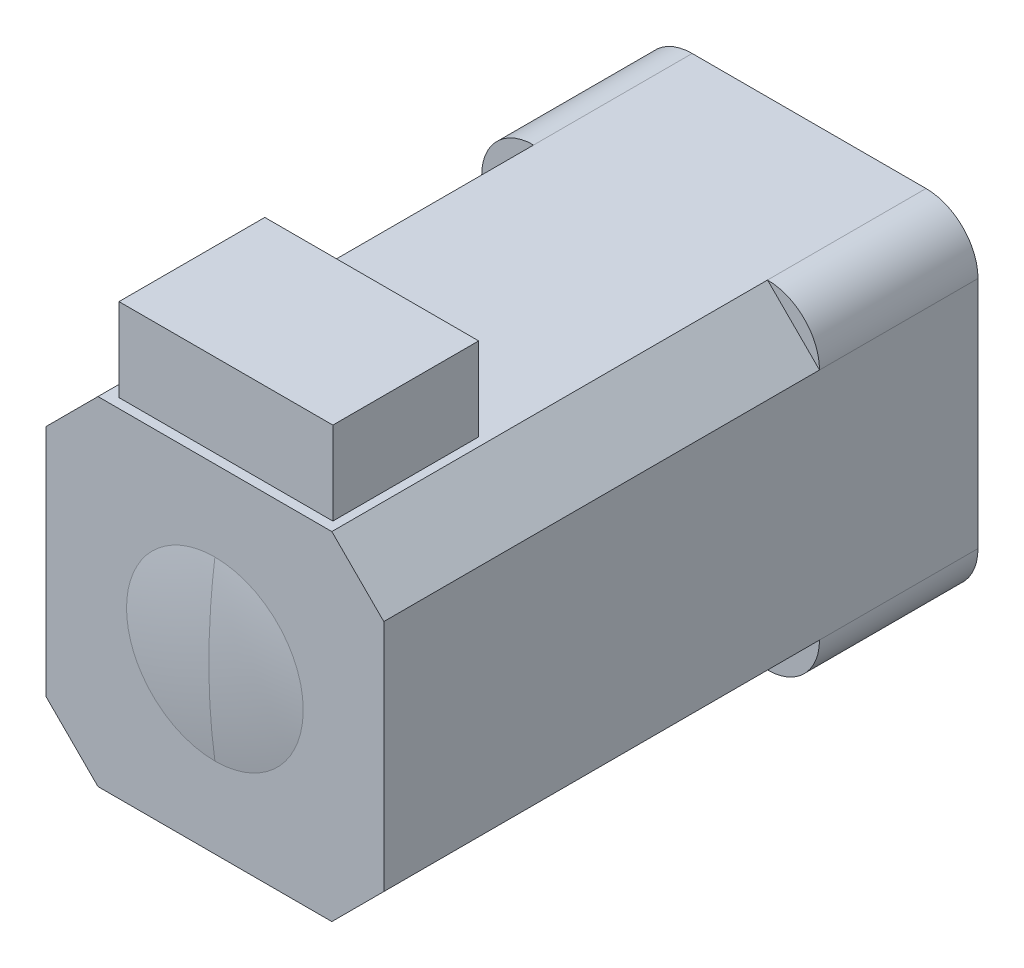
ISO-10303-21;
HEADER;
FILE_DESCRIPTION(('STEP AP214'),'2;1');
FILE_NAME('part.step','',(''),(''),'','','');
FILE_SCHEMA(('AUTOMOTIVE_DESIGN { 1 0 10303 214 1 1 1 1 }'));
ENDSEC;
DATA;
#1=APPLICATION_CONTEXT('core data for automotive mechanical design processes');
#2=APPLICATION_PROTOCOL_DEFINITION('international standard','automotive_design',2000,#1);
#3=PRODUCT_CONTEXT('',#1,'mechanical');
#4=PRODUCT('Part','Part','',(#3));
#5=PRODUCT_RELATED_PRODUCT_CATEGORY('part','',(#4));
#6=PRODUCT_DEFINITION_FORMATION('','',#4);
#7=PRODUCT_DEFINITION_CONTEXT('part definition',#1,'design');
#8=PRODUCT_DEFINITION('design','',#6,#7);
#9=PRODUCT_DEFINITION_SHAPE('','',#8);
#10=(LENGTH_UNIT() NAMED_UNIT(*) SI_UNIT(.MILLI.,.METRE.));
#11=(NAMED_UNIT(*) PLANE_ANGLE_UNIT() SI_UNIT($,.RADIAN.));
#12=(NAMED_UNIT(*) SI_UNIT($,.STERADIAN.) SOLID_ANGLE_UNIT());
#13=UNCERTAINTY_MEASURE_WITH_UNIT(LENGTH_MEASURE(1.E-05),#10,'distance_accuracy_value','');
#14=(GEOMETRIC_REPRESENTATION_CONTEXT(3) GLOBAL_UNCERTAINTY_ASSIGNED_CONTEXT((#13)) GLOBAL_UNIT_ASSIGNED_CONTEXT((#10,
#11,#12)) REPRESENTATION_CONTEXT('',''));
#15=CARTESIAN_POINT('',(0.,0.,0.));
#16=DIRECTION('',(0.,0.,1.));
#17=DIRECTION('',(1.,0.,0.));
#18=AXIS2_PLACEMENT_3D('',#15,#16,#17);
#19=CARTESIAN_POINT('',(1533.40236962723,97.0000000000027,1693.5));
#20=DIRECTION('',(0.,1.,0.));
#21=DIRECTION('',(0.,0.,1.));
#22=AXIS2_PLACEMENT_3D('',#19,#20,#21);
#23=PLANE('',#22);
#24=DIRECTION('',(0.,0.,1.));
#25=VECTOR('',#24,1.);
#26=CARTESIAN_POINT('',(1546.71167023781,97.0000000000028,1690.37389267724));
#27=LINE('',#26,#25);
#28=CARTESIAN_POINT('',(1546.71167023781,97.0000000000028,1746.49254262433));
#29=VERTEX_POINT('',#28);
#30=CARTESIAN_POINT('',(1546.71167023781,97.0000000000028,1690.37389267724));
#31=VERTEX_POINT('',#30);
#32=EDGE_CURVE('E195',#29,#31,#27,.F.);
#33=ORIENTED_EDGE('',*,*,#32,.T.);
#34=DIRECTION('',(1.,0.,0.));
#35=VECTOR('',#34,1.);
#36=CARTESIAN_POINT('',(1464.40226837174,97.0000000000028,1690.37389267724));
#37=LINE('',#36,#35);
#38=CARTESIAN_POINT('',(1464.40226837174,97.0000000000028,1690.37389267724));
#39=VERTEX_POINT('',#38);
#40=EDGE_CURVE('E185',#31,#39,#37,.F.);
#41=ORIENTED_EDGE('',*,*,#40,.T.);
#42=DIRECTION('',(0.,0.,1.));
#43=VECTOR('',#42,1.);
#44=CARTESIAN_POINT('',(1464.40226837174,97.0000000000028,1690.37389267724));
#45=LINE('',#44,#43);
#46=CARTESIAN_POINT('',(1464.40226837174,97.0000000000028,1746.49254262433));
#47=VERTEX_POINT('',#46);
#48=EDGE_CURVE('E189',#39,#47,#45,.T.);
#49=ORIENTED_EDGE('',*,*,#48,.T.);
#50=DIRECTION('',(1.,0.,0.));
#51=VECTOR('',#50,1.);
#52=CARTESIAN_POINT('',(1464.40226837174,97.0000000000028,1746.49254262433));
#53=LINE('',#52,#51);
#54=EDGE_CURVE('E193',#47,#29,#53,.T.);
#55=ORIENTED_EDGE('',*,*,#54,.T.);
#56=EDGE_LOOP('',(#33,#41,#49,#55));
#57=FACE_BOUND('',#56,.T.);
#58=ADVANCED_FACE('F17',(#57),#23,.T.);
#59=CARTESIAN_POINT('',(1505.,7.65638399887561E-12,1582.5));
#60=DIRECTION('',(0.,0.,1.));
#61=DIRECTION('',(0.,-1.,0.));
#62=AXIS2_PLACEMENT_3D('',#59,#60,#61);
#63=PLANE('',#62);
#64=CARTESIAN_POINT('',(1550.,45.0000000000076,1582.5));
#65=DIRECTION('',(0.,0.,1.));
#66=DIRECTION('',(0.,-1.,0.));
#67=AXIS2_PLACEMENT_3D('',#64,#65,#66);
#68=CIRCLE('',#67,20.);
#69=CARTESIAN_POINT('',(1550.,65.0000000000077,1582.5));
#70=VERTEX_POINT('',#69);
#71=CARTESIAN_POINT('',(1570.,45.0000000000077,1582.5));
#72=VERTEX_POINT('',#71);
#73=EDGE_CURVE('E143',#70,#72,#68,.F.);
#74=ORIENTED_EDGE('',*,*,#73,.F.);
#75=DIRECTION('',(0.707106781186547,-0.707106781186548,0.));
#76=VECTOR('',#75,1.);
#77=CARTESIAN_POINT('',(1570.,45.0000000000077,1582.5));
#78=LINE('',#77,#76);
#79=EDGE_CURVE('E174',#70,#72,#78,.T.);
#80=ORIENTED_EDGE('',*,*,#79,.T.);
#81=EDGE_LOOP('',(#74,#80));
#82=FACE_BOUND('',#81,.T.);
#83=ADVANCED_FACE('F352',(#82),#63,.T.);
#84=CARTESIAN_POINT('',(1546.71167023781,196.61998046293,1690.37389267724));
#85=DIRECTION('',(-1.,0.,0.));
#86=DIRECTION('',(0.,-1.,0.));
#87=AXIS2_PLACEMENT_3D('',#84,#85,#86);
#88=PLANE('',#87);
#89=DIRECTION('',(0.,0.,1.));
#90=VECTOR('',#89,1.);
#91=CARTESIAN_POINT('',(1546.71167023781,65.0000000000077,1583.5));
#92=LINE('',#91,#90);
#93=CARTESIAN_POINT('',(1546.71167023781,65.0000000000078,1690.37389267724));
#94=VERTEX_POINT('',#93);
#95=CARTESIAN_POINT('',(1546.71167023781,65.0000000000078,1746.49254262433));
#96=VERTEX_POINT('',#95);
#97=EDGE_CURVE('E198',#94,#96,#92,.T.);
#98=ORIENTED_EDGE('',*,*,#97,.F.);
#99=DIRECTION('',(0.,-1.,0.));
#100=VECTOR('',#99,1.);
#101=CARTESIAN_POINT('',(1546.71167023781,196.61998046293,1690.37389267724));
#102=LINE('',#101,#100);
#103=EDGE_CURVE('E144',#94,#31,#102,.F.);
#104=ORIENTED_EDGE('',*,*,#103,.T.);
#105=ORIENTED_EDGE('',*,*,#32,.F.);
#106=DIRECTION('',(0.,1.,0.));
#107=VECTOR('',#106,1.);
#108=CARTESIAN_POINT('',(1546.71167023781,196.61998046293,1746.49254262433));
#109=LINE('',#108,#107);
#110=EDGE_CURVE('E191',#29,#96,#109,.F.);
#111=ORIENTED_EDGE('',*,*,#110,.T.);
#112=EDGE_LOOP('',(#98,#104,#105,#111));
#113=FACE_BOUND('',#112,.T.);
#114=ADVANCED_FACE('F400',(#113),#88,.F.);
#115=CARTESIAN_POINT('',(1464.40226837174,196.61998046293,1746.49254262433));
#116=DIRECTION('',(0.,0.,-1.));
#117=DIRECTION('',(0.,1.,0.));
#118=AXIS2_PLACEMENT_3D('',#115,#116,#117);
#119=PLANE('',#118);
#120=DIRECTION('',(1.,0.,0.));
#121=VECTOR('',#120,1.);
#122=CARTESIAN_POINT('',(1466.,65.0000000000079,1746.49254262433));
#123=LINE('',#122,#121);
#124=CARTESIAN_POINT('',(1464.40226837174,65.0000000000078,1746.49254262433));
#125=VERTEX_POINT('',#124);
#126=EDGE_CURVE('E320',#96,#125,#123,.F.);
#127=ORIENTED_EDGE('',*,*,#126,.F.);
#128=ORIENTED_EDGE('',*,*,#110,.F.);
#129=ORIENTED_EDGE('',*,*,#54,.F.);
#130=DIRECTION('',(0.,1.,0.));
#131=VECTOR('',#130,1.);
#132=CARTESIAN_POINT('',(1464.40226837174,196.61998046293,1746.49254262433));
#133=LINE('',#132,#131);
#134=EDGE_CURVE('E187',#47,#125,#133,.F.);
#135=ORIENTED_EDGE('',*,*,#134,.T.);
#136=EDGE_LOOP('',(#127,#128,#129,#135));
#137=FACE_BOUND('',#136,.T.);
#138=ADVANCED_FACE('F396',(#137),#119,.F.);
#139=CARTESIAN_POINT('',(1464.40226837174,196.61998046293,1690.37389267724));
#140=DIRECTION('',(1.,0.,0.));
#141=DIRECTION('',(0.,1.,0.));
#142=AXIS2_PLACEMENT_3D('',#139,#140,#141);
#143=PLANE('',#142);
#144=DIRECTION('',(0.,0.,1.));
#145=VECTOR('',#144,1.);
#146=CARTESIAN_POINT('',(1464.40226837174,65.0000000000077,1583.5));
#147=LINE('',#146,#145);
#148=CARTESIAN_POINT('',(1464.40226837174,65.0000000000078,1690.37389267724));
#149=VERTEX_POINT('',#148);
#150=EDGE_CURVE('E317',#125,#149,#147,.F.);
#151=ORIENTED_EDGE('',*,*,#150,.F.);
#152=ORIENTED_EDGE('',*,*,#134,.F.);
#153=ORIENTED_EDGE('',*,*,#48,.F.);
#154=DIRECTION('',(0.,-1.,0.));
#155=VECTOR('',#154,1.);
#156=CARTESIAN_POINT('',(1464.40226837174,196.61998046293,1690.37389267724));
#157=LINE('',#156,#155);
#158=EDGE_CURVE('E183',#39,#149,#157,.T.);
#159=ORIENTED_EDGE('',*,*,#158,.T.);
#160=EDGE_LOOP('',(#151,#152,#153,#159));
#161=FACE_BOUND('',#160,.T.);
#162=ADVANCED_FACE('F392',(#161),#143,.F.);
#163=CARTESIAN_POINT('',(1464.40226837174,196.61998046293,1690.37389267724));
#164=DIRECTION('',(0.,0.,1.));
#165=DIRECTION('',(0.,-1.,0.));
#166=AXIS2_PLACEMENT_3D('',#163,#164,#165);
#167=PLANE('',#166);
#168=DIRECTION('',(1.,0.,0.));
#169=VECTOR('',#168,1.);
#170=CARTESIAN_POINT('',(1466.,65.0000000000078,1690.37389267724));
#171=LINE('',#170,#169);
#172=EDGE_CURVE('E311',#149,#94,#171,.T.);
#173=ORIENTED_EDGE('',*,*,#172,.F.);
#174=ORIENTED_EDGE('',*,*,#158,.F.);
#175=ORIENTED_EDGE('',*,*,#40,.F.);
#176=ORIENTED_EDGE('',*,*,#103,.F.);
#177=EDGE_LOOP('',(#173,#174,#175,#176));
#178=FACE_BOUND('',#177,.T.);
#179=ADVANCED_FACE('F389',(#178),#167,.F.);
#180=CARTESIAN_POINT('',(1505.,7.65638399887561E-12,1582.5));
#181=DIRECTION('',(0.,0.,1.));
#182=DIRECTION('',(0.,-1.,0.));
#183=AXIS2_PLACEMENT_3D('',#180,#181,#182);
#184=PLANE('',#183);
#185=CARTESIAN_POINT('',(1460.,45.0000000000077,1582.5));
#186=DIRECTION('',(0.,0.,1.));
#187=DIRECTION('',(0.,-1.,0.));
#188=AXIS2_PLACEMENT_3D('',#185,#186,#187);
#189=CIRCLE('',#188,20.);
#190=CARTESIAN_POINT('',(1440.,45.0000000000076,1582.5));
#191=VERTEX_POINT('',#190);
#192=CARTESIAN_POINT('',(1460.,65.0000000000077,1582.5));
#193=VERTEX_POINT('',#192);
#194=EDGE_CURVE('E20',#191,#193,#189,.F.);
#195=ORIENTED_EDGE('',*,*,#194,.F.);
#196=DIRECTION('',(0.707106781186547,0.707106781186548,0.));
#197=VECTOR('',#196,1.);
#198=CARTESIAN_POINT('',(1460.,65.0000000000077,1582.5));
#199=LINE('',#198,#197);
#200=EDGE_CURVE('E145',#191,#193,#199,.T.);
#201=ORIENTED_EDGE('',*,*,#200,.T.);
#202=EDGE_LOOP('',(#195,#201));
#203=FACE_BOUND('',#202,.T.);
#204=ADVANCED_FACE('F146',(#203),#184,.T.);
#205=CARTESIAN_POINT('',(1460.,45.0000000000075,1337.65221692848));
#206=DIRECTION('',(0.,0.,1.));
#207=DIRECTION('',(0.,-1.,0.));
#208=AXIS2_PLACEMENT_3D('',#205,#206,#207);
#209=CYLINDRICAL_SURFACE('',#208,20.);
#210=CARTESIAN_POINT('',(1460.,45.0000000000077,1521.49998003698));
#211=DIRECTION('',(0.,0.,1.));
#212=DIRECTION('',(0.,-1.,0.));
#213=AXIS2_PLACEMENT_3D('',#210,#211,#212);
#214=CIRCLE('',#213,20.);
#215=CARTESIAN_POINT('',(1440.,45.0000000000076,1521.49998003698));
#216=VERTEX_POINT('',#215);
#217=CARTESIAN_POINT('',(1460.,65.0000000000076,1521.49998003698));
#218=VERTEX_POINT('',#217);
#219=EDGE_CURVE('E296',#216,#218,#214,.F.);
#220=ORIENTED_EDGE('',*,*,#219,.F.);
#221=DIRECTION('',(0.,0.,1.));
#222=VECTOR('',#221,1.);
#223=CARTESIAN_POINT('',(1440.00000000001,45.0000000000076,1693.5));
#224=LINE('',#223,#222);
#225=EDGE_CURVE('E141',#191,#216,#224,.F.);
#226=ORIENTED_EDGE('',*,*,#225,.F.);
#227=ORIENTED_EDGE('',*,*,#194,.T.);
#228=DIRECTION('',(0.,0.,1.));
#229=VECTOR('',#228,1.);
#230=CARTESIAN_POINT('',(1460.,65.0000000000077,1583.5));
#231=LINE('',#230,#229);
#232=EDGE_CURVE('E139',#218,#193,#231,.T.);
#233=ORIENTED_EDGE('',*,*,#232,.F.);
#234=EDGE_LOOP('',(#220,#226,#227,#233));
#235=FACE_BOUND('',#234,.T.);
#236=ADVANCED_FACE('F137',(#235),#209,.T.);
#237=CARTESIAN_POINT('',(1550.,45.0000000000074,1337.65221692848));
#238=DIRECTION('',(0.,0.,1.));
#239=DIRECTION('',(0.,-1.,0.));
#240=AXIS2_PLACEMENT_3D('',#237,#238,#239);
#241=CYLINDRICAL_SURFACE('',#240,20.);
#242=CARTESIAN_POINT('',(1550.,45.0000000000076,1521.49998003698));
#243=DIRECTION('',(0.,0.,1.));
#244=DIRECTION('',(0.,-1.,0.));
#245=AXIS2_PLACEMENT_3D('',#242,#243,#244);
#246=CIRCLE('',#245,20.);
#247=CARTESIAN_POINT('',(1550.,65.0000000000076,1521.49998003698));
#248=VERTEX_POINT('',#247);
#249=CARTESIAN_POINT('',(1570.,45.0000000000076,1521.49998003698));
#250=VERTEX_POINT('',#249);
#251=EDGE_CURVE('E294',#248,#250,#246,.F.);
#252=ORIENTED_EDGE('',*,*,#251,.F.);
#253=DIRECTION('',(0.,0.,1.));
#254=VECTOR('',#253,1.);
#255=CARTESIAN_POINT('',(1550.,65.0000000000077,1583.5));
#256=LINE('',#255,#254);
#257=EDGE_CURVE('E161',#70,#248,#256,.F.);
#258=ORIENTED_EDGE('',*,*,#257,.F.);
#259=ORIENTED_EDGE('',*,*,#73,.T.);
#260=DIRECTION('',(0.,0.,1.));
#261=VECTOR('',#260,1.);
#262=CARTESIAN_POINT('',(1570.,45.0000000000076,1583.5));
#263=LINE('',#262,#261);
#264=EDGE_CURVE('E178',#250,#72,#263,.T.);
#265=ORIENTED_EDGE('',*,*,#264,.F.);
#266=EDGE_LOOP('',(#252,#258,#259,#265));
#267=FACE_BOUND('',#266,.T.);
#268=ADVANCED_FACE('F348',(#267),#241,.T.);
#269=CARTESIAN_POINT('',(1505.,7.65638399887561E-12,1582.5));
#270=DIRECTION('',(0.,0.,1.));
#271=DIRECTION('',(0.,-1.,0.));
#272=AXIS2_PLACEMENT_3D('',#269,#270,#271);
#273=PLANE('',#272);
#274=CARTESIAN_POINT('',(1550.,-44.9999999999924,1582.5));
#275=DIRECTION('',(0.,0.,1.));
#276=DIRECTION('',(0.,-1.,0.));
#277=AXIS2_PLACEMENT_3D('',#274,#275,#276);
#278=CIRCLE('',#277,20.);
#279=CARTESIAN_POINT('',(1570.,-44.9999999999923,1582.5));
#280=VERTEX_POINT('',#279);
#281=CARTESIAN_POINT('',(1550.,-64.9999999999956,1582.5));
#282=VERTEX_POINT('',#281);
#283=EDGE_CURVE('E366',#280,#282,#278,.F.);
#284=ORIENTED_EDGE('',*,*,#283,.F.);
#285=DIRECTION('',(-0.707106781186548,-0.707106781186547,0.));
#286=VECTOR('',#285,1.);
#287=CARTESIAN_POINT('',(1550.,-64.9999999999923,1582.5));
#288=LINE('',#287,#286);
#289=EDGE_CURVE('E327',#280,#282,#288,.T.);
#290=ORIENTED_EDGE('',*,*,#289,.T.);
#291=EDGE_LOOP('',(#284,#290));
#292=FACE_BOUND('',#291,.T.);
#293=ADVANCED_FACE('F365',(#292),#273,.T.);
#294=CARTESIAN_POINT('',(1570.,39.0000000000076,1583.5));
#295=DIRECTION('',(1.,0.,0.));
#296=DIRECTION('',(0.,1.,0.));
#297=AXIS2_PLACEMENT_3D('',#294,#295,#296);
#298=PLANE('',#297);
#299=DIRECTION('',(0.,1.,0.));
#300=VECTOR('',#299,1.);
#301=CARTESIAN_POINT('',(1570.,5.80032032303539,1521.49998003698));
#302=LINE('',#301,#300);
#303=CARTESIAN_POINT('',(1570.,-44.9999999999924,1521.49998003698));
#304=VERTEX_POINT('',#303);
#305=EDGE_CURVE('E291',#250,#304,#302,.F.);
#306=ORIENTED_EDGE('',*,*,#305,.F.);
#307=ORIENTED_EDGE('',*,*,#264,.T.);
#308=DIRECTION('',(0.,0.,1.));
#309=VECTOR('',#308,1.);
#310=CARTESIAN_POINT('',(1570.,45.0000000000077,1750.17750649952));
#311=LINE('',#310,#309);
#312=CARTESIAN_POINT('',(1570.,45.0000000000077,1750.17750649952));
#313=VERTEX_POINT('',#312);
#314=EDGE_CURVE('E177',#72,#313,#311,.T.);
#315=ORIENTED_EDGE('',*,*,#314,.T.);
#316=DIRECTION('',(0.,-1.,0.));
#317=VECTOR('',#316,1.);
#318=CARTESIAN_POINT('',(1570.,65.0000000000078,1750.17750649952));
#319=LINE('',#318,#317);
#320=CARTESIAN_POINT('',(1570.,-44.9999999999921,1750.17750649952));
#321=VERTEX_POINT('',#320);
#322=EDGE_CURVE('E287',#321,#313,#319,.F.);
#323=ORIENTED_EDGE('',*,*,#322,.F.);
#324=DIRECTION('',(0.,0.,1.));
#325=VECTOR('',#324,1.);
#326=CARTESIAN_POINT('',(1570.,-44.9999999999922,1750.17750649952));
#327=LINE('',#326,#325);
#328=EDGE_CURVE('E290',#321,#280,#327,.F.);
#329=ORIENTED_EDGE('',*,*,#328,.T.);
#330=DIRECTION('',(0.,0.,1.));
#331=VECTOR('',#330,1.);
#332=CARTESIAN_POINT('',(1570.,-44.9999999999924,1337.65221692848));
#333=LINE('',#332,#331);
#334=EDGE_CURVE('E328',#304,#280,#333,.T.);
#335=ORIENTED_EDGE('',*,*,#334,.F.);
#336=EDGE_LOOP('',(#306,#307,#315,#323,#329,#335));
#337=FACE_BOUND('',#336,.T.);
#338=ADVANCED_FACE('F356',(#337),#298,.T.);
#339=CARTESIAN_POINT('',(1570.,45.0000000000078,1750.17750649952));
#340=DIRECTION('',(-0.707106781186548,-0.707106781186547,0.));
#341=DIRECTION('',(0.707106781186547,-0.707106781186548,0.));
#342=AXIS2_PLACEMENT_3D('',#339,#340,#341);
#343=PLANE('',#342);
#344=DIRECTION('',(-0.707106781186546,0.707106781186549,0.));
#345=VECTOR('',#344,1.);
#346=CARTESIAN_POINT('',(1570.,45.0000000000077,1750.17750649952));
#347=LINE('',#346,#345);
#348=CARTESIAN_POINT('',(1550.,65.0000000000078,1750.17750649952));
#349=VERTEX_POINT('',#348);
#350=EDGE_CURVE('E284',#313,#349,#347,.T.);
#351=ORIENTED_EDGE('',*,*,#350,.F.);
#352=ORIENTED_EDGE('',*,*,#314,.F.);
#353=ORIENTED_EDGE('',*,*,#79,.F.);
#354=DIRECTION('',(0.,0.,1.));
#355=VECTOR('',#354,1.);
#356=CARTESIAN_POINT('',(1550.,65.0000000000077,1583.5));
#357=LINE('',#356,#355);
#358=EDGE_CURVE('E151',#349,#70,#357,.F.);
#359=ORIENTED_EDGE('',*,*,#358,.F.);
#360=EDGE_LOOP('',(#351,#352,#353,#359));
#361=FACE_BOUND('',#360,.T.);
#362=ADVANCED_FACE('F360',(#361),#343,.F.);
#363=CARTESIAN_POINT('',(1466.,65.0000000000077,1583.5));
#364=DIRECTION('',(0.,1.,0.));
#365=DIRECTION('',(0.,0.,1.));
#366=AXIS2_PLACEMENT_3D('',#363,#364,#365);
#367=PLANE('',#366);
#368=DIRECTION('',(1.,0.,0.));
#369=VECTOR('',#368,1.);
#370=CARTESIAN_POINT('',(1440.,65.0000000000078,1750.17750649952));
#371=LINE('',#370,#369);
#372=CARTESIAN_POINT('',(1460.,65.0000000000078,1750.17750649952));
#373=VERTEX_POINT('',#372);
#374=EDGE_CURVE('E282',#349,#373,#371,.F.);
#375=ORIENTED_EDGE('',*,*,#374,.F.);
#376=ORIENTED_EDGE('',*,*,#358,.T.);
#377=ORIENTED_EDGE('',*,*,#257,.T.);
#378=DIRECTION('',(1.,0.,0.));
#379=VECTOR('',#378,1.);
#380=CARTESIAN_POINT('',(1505.,65.0000000000076,1521.49998003698));
#381=LINE('',#380,#379);
#382=EDGE_CURVE('E159',#218,#248,#381,.T.);
#383=ORIENTED_EDGE('',*,*,#382,.F.);
#384=ORIENTED_EDGE('',*,*,#232,.T.);
#385=DIRECTION('',(0.,0.,1.));
#386=VECTOR('',#385,1.);
#387=CARTESIAN_POINT('',(1460.,65.0000000000077,1750.17750649952));
#388=LINE('',#387,#386);
#389=EDGE_CURVE('E150',#193,#373,#388,.T.);
#390=ORIENTED_EDGE('',*,*,#389,.T.);
#391=EDGE_LOOP('',(#375,#376,#377,#383,#384,#390));
#392=FACE_BOUND('',#391,.T.);
#393=ORIENTED_EDGE('',*,*,#150,.T.);
#394=ORIENTED_EDGE('',*,*,#172,.T.);
#395=ORIENTED_EDGE('',*,*,#97,.T.);
#396=ORIENTED_EDGE('',*,*,#126,.T.);
#397=EDGE_LOOP('',(#393,#394,#395,#396));
#398=FACE_BOUND('',#397,.T.);
#399=ADVANCED_FACE('F155',(#392,#398),#367,.T.);
#400=CARTESIAN_POINT('',(1460.,65.0000000000078,1750.17750649952));
#401=DIRECTION('',(0.707106781186548,-0.707106781186547,0.));
#402=DIRECTION('',(0.707106781186547,0.707106781186548,0.));
#403=AXIS2_PLACEMENT_3D('',#400,#401,#402);
#404=PLANE('',#403);
#405=DIRECTION('',(-0.707106781186544,-0.707106781186551,0.));
#406=VECTOR('',#405,1.);
#407=CARTESIAN_POINT('',(1460.,65.0000000000078,1750.17750649952));
#408=LINE('',#407,#406);
#409=CARTESIAN_POINT('',(1440.,45.0000000000077,1750.17750649952));
#410=VERTEX_POINT('',#409);
#411=EDGE_CURVE('E165',#373,#410,#408,.T.);
#412=ORIENTED_EDGE('',*,*,#411,.F.);
#413=ORIENTED_EDGE('',*,*,#389,.F.);
#414=ORIENTED_EDGE('',*,*,#200,.F.);
#415=DIRECTION('',(0.,0.,1.));
#416=VECTOR('',#415,1.);
#417=CARTESIAN_POINT('',(1440.00000000001,45.0000000000076,1693.5));
#418=LINE('',#417,#416);
#419=EDGE_CURVE('E173',#410,#191,#418,.F.);
#420=ORIENTED_EDGE('',*,*,#419,.F.);
#421=EDGE_LOOP('',(#412,#413,#414,#420));
#422=FACE_BOUND('',#421,.T.);
#423=ADVANCED_FACE('F163',(#422),#404,.F.);
#424=CARTESIAN_POINT('',(1505.,-34.4035175258015,1750.1215207102));
#425=CARTESIAN_POINT('',(1493.65664513052,-34.4035175258014,1750.1215207102));
#426=CARTESIAN_POINT('',(1482.34001705167,-34.4035175258014,1749.34329926354));
#427=CARTESIAN_POINT('',(1471.10344339938,-34.4035175258015,1747.79052360304));
#428=CARTESIAN_POINT('',(1505.00000000001,-11.6775888948183,1753.2789680524));
#429=CARTESIAN_POINT('',(1493.51200485216,-11.6775888948183,1753.2789680524));
#430=CARTESIAN_POINT('',(1482.05107729099,-11.6775888948183,1752.49082342446));
#431=CARTESIAN_POINT('',(1470.67122493856,-11.6775888948183,1750.91824816267));
#432=CARTESIAN_POINT('',(1505.00000000001,11.2666250264183,1753.29776687901));
#433=CARTESIAN_POINT('',(1493.51114369211,11.2666250264182,1753.29776687901));
#434=CARTESIAN_POINT('',(1482.04935699992,11.2666250264182,1752.50956317038));
#435=CARTESIAN_POINT('',(1470.66865159401,11.2666250264183,1750.93687002562));
#436=CARTESIAN_POINT('',(1505.,33.997697109422,1750.17756370988));
#437=CARTESIAN_POINT('',(1493.65407784303,33.997697109422,1750.17756370988));
#438=CARTESIAN_POINT('',(1482.33488852563,33.997697109422,1749.39916613207));
#439=CARTESIAN_POINT('',(1471.09577175314,33.997697109422,1747.84603903924));
#440=CARTESIAN_POINT('',(1505.,34.2235830990624,1750.14655724533));
#441=CARTESIAN_POINT('',(1493.65549822576,34.2235830990624,1750.14655724533));
#442=CARTESIAN_POINT('',(1482.33772594443,34.2235830990624,1749.3682571142));
#443=CARTESIAN_POINT('',(1471.10001618382,34.2235830990624,1747.81532445554));
#444=CARTESIAN_POINT('',(1505.,34.4494690887031,1750.11555078078));
#445=CARTESIAN_POINT('',(1493.65691860848,34.4494690887031,1750.11555078078));
#446=CARTESIAN_POINT('',(1482.34056336323,34.4494690887031,1749.33734809633));
#447=CARTESIAN_POINT('',(1471.1042606145,34.4494690887032,1747.78460987184));
#448=CARTESIAN_POINT('',(1505.,34.6753550783438,1750.08454431623));
#449=CARTESIAN_POINT('',(1493.65833899121,34.6753550783438,1750.08454431623));
#450=CARTESIAN_POINT('',(1482.34340078203,34.6753550783439,1749.30643907846));
#451=CARTESIAN_POINT('',(1471.10850504519,34.6753550783438,1747.75389528813));
#452=(BOUNDED_SURFACE() B_SPLINE_SURFACE(3,3,((#424,#425,#426,#427),(#428,#429,#430,#431),(#432,
#433,#434,#435),(#436,#437,#438,#439),(#440,#441,#442,#443),(#444,#445,#446,#447),(#448,#449,
#450,#451)),.UNSPECIFIED.,.F.,.F.,.F.) B_SPLINE_SURFACE_WITH_KNOTS((4,3,4),(4,4),(0.,
0.99009900990099,1.),(0.,1.),
.UNSPECIFIED.) GEOMETRIC_REPRESENTATION_ITEM() RATIONAL_B_SPLINE_SURFACE(((1.,0.998429224807992,
0.998429224807992,1.),(0.993732230560502,0.992171300625239,0.992171300625239,0.993732230560502),
(0.993732230560502,0.992171300625239,0.992171300625239,0.993732230560502),(1.,0.998429224807992,
0.998429224807992,1.),(1.,0.998429224807992,0.998429224807992,1.),(1.,0.998429224807992,
0.998429224807992,1.),(1.,0.998429224807992,0.998429224807992,1.))) REPRESENTATION_ITEM('') SURFACE());
#453=CARTESIAN_POINT('',(1505.,-34.4035175258006,1750.1215207102));
#454=CARTESIAN_POINT('',(1505.,-11.6775888948177,1753.2789680524));
#455=CARTESIAN_POINT('',(1505.,11.2666250264186,1753.29776687901));
#456=CARTESIAN_POINT('',(1505.,33.9976971094216,1750.17756370988));
#457=CARTESIAN_POINT('',(1505.,34.2235830990624,1750.14655724533));
#458=CARTESIAN_POINT('',(1505.,34.4494690887031,1750.11555078078));
#459=CARTESIAN_POINT('',(1505.,34.6753550783438,1750.08454431623));
#460=(BOUNDED_CURVE() B_SPLINE_CURVE(3,(#453,#454,#455,#456,#457,#458,#459),.UNSPECIFIED.,.F.,
.F.) B_SPLINE_CURVE_WITH_KNOTS((4,3,4),(0.,0.99009900990099,1.),
.UNSPECIFIED.) CURVE() GEOMETRIC_REPRESENTATION_ITEM() RATIONAL_B_SPLINE_CURVE((1.,
0.993732230560502,0.993732230560502,1.,1.,1.,1.)) REPRESENTATION_ITEM(''));
#461=CARTESIAN_POINT('',(1505.,33.9981138940976,1750.17750649952));
#462=VERTEX_POINT('',#461);
#463=CARTESIAN_POINT('',(1505.,-33.9981221856671,1750.17750649952));
#464=VERTEX_POINT('',#463);
#465=EDGE_CURVE('E167',#462,#464,#460,.F.);
#466=CARTESIAN_POINT('',(1505.,-33.9981221856517,1750.17750649952));
#467=CARTESIAN_POINT('',(1504.51620505003,-33.9981288703873,1750.17750649952));
#468=CARTESIAN_POINT('',(1504.03241087177,-33.9877957740208,1750.17750649952));
#469=CARTESIAN_POINT('',(1503.06578157308,-33.9465016168176,1750.17750649952));
#470=CARTESIAN_POINT('',(1502.58294631088,-33.9155438747433,1750.17750649952));
#471=CARTESIAN_POINT('',(1501.61907361368,-33.8330552020268,1750.17750649952));
#472=CARTESIAN_POINT('',(1501.13803604178,-33.7815258715068,1750.17750649952));
#473=CARTESIAN_POINT('',(1500.1780983516,-33.6579264511889,1750.17750649952));
#474=CARTESIAN_POINT('',(1499.69920099199,-33.5858349542859,1750.17750649952));
#475=CARTESIAN_POINT('',(1498.74487922632,-33.4212540076766,1750.17750649952));
#476=CARTESIAN_POINT('',(1498.26945507668,-33.3287630672568,1750.17750649952));
#477=CARTESIAN_POINT('',(1497.32295125557,-33.1235544266057,1750.17750649952));
#478=CARTESIAN_POINT('',(1496.85187225,-33.0108336784691,1750.17750649952));
#479=CARTESIAN_POINT('',(1495.45908172851,-32.6459133167455,1750.17750649952));
#480=CARTESIAN_POINT('',(1494.54478646211,-32.3646992083407,1750.17750649952));
#481=CARTESIAN_POINT('',(1492.74310158162,-31.7262458261047,1750.17750649952));
#482=CARTESIAN_POINT('',(1491.85571654641,-31.3689936961088,1750.17750649952));
#483=CARTESIAN_POINT('',(1490.11397654555,-30.5809148279602,1750.17750649952));
#484=CARTESIAN_POINT('',(1489.25962862123,-30.1500725100715,1750.17750649952));
#485=CARTESIAN_POINT('',(1487.59031690462,-29.2179590062832,1750.17750649952));
#486=CARTESIAN_POINT('',(1486.77535140145,-28.7166908835744,1750.17750649952));
#487=CARTESIAN_POINT('',(1485.19065405354,-27.64734500211,1750.17750649952));
#488=CARTESIAN_POINT('',(1484.42091620115,-27.0792761468009,1750.17750649952));
#489=CARTESIAN_POINT('',(1482.93202380145,-25.8803080443701,1750.17750649952));
#490=CARTESIAN_POINT('',(1482.21286979752,-25.2494081224703,1750.17750649952));
#491=CARTESIAN_POINT('',(1480.8302521391,-23.9292547739817,1750.17750649952));
#492=CARTESIAN_POINT('',(1480.16678960648,-23.2400001724318,1750.17750649952));
#493=CARTESIAN_POINT('',(1478.90028985757,-21.8080506145888,1750.17750649952));
#494=CARTESIAN_POINT('',(1478.29725248686,-21.0653557948701,1750.17750649952));
#495=CARTESIAN_POINT('',(1477.15588531465,-19.5318003120571,1750.17750649952));
#496=CARTESIAN_POINT('',(1476.61755586271,-18.7409393887904,1750.17750649952));
#497=CARTESIAN_POINT('',(1475.60943536752,-17.1166775882282,1750.17750649952));
#498=CARTESIAN_POINT('',(1475.1396443632,-16.2832766867585,1750.17750649952));
#499=CARTESIAN_POINT('',(1474.27195567419,-14.5798890065868,1750.17750649952));
#500=CARTESIAN_POINT('',(1473.87405558885,-13.7099034507483,1750.17750649952));
#501=CARTESIAN_POINT('',(1473.15295821964,-11.9395054349982,1750.17750649952));
#502=CARTESIAN_POINT('',(1472.82976092454,-11.0390929796608,1750.17750649952));
#503=CARTESIAN_POINT('',(1472.26036460189,-9.21423541136065,1750.17750649952));
#504=CARTESIAN_POINT('',(1472.01416614893,-8.28979011911153,1750.17750649952));
#505=CARTESIAN_POINT('',(1471.600521069,-6.42344542506151,1750.17750649952));
#506=CARTESIAN_POINT('',(1471.43307444594,-5.481546022393,1750.17750649952));
#507=CARTESIAN_POINT('',(1471.17812114727,-3.58697211437784,1750.17750649952));
#508=CARTESIAN_POINT('',(1471.09061592601,-2.63429741331928,1750.17750649952));
#509=CARTESIAN_POINT('',(1470.99617278563,-0.724962835803563,1750.17750649952));
#510=CARTESIAN_POINT('',(1470.98923486701,0.23169704067867,1750.17750649952));
#511=CARTESIAN_POINT('',(1471.05597555752,2.1421977395689,1750.17750649952));
#512=CARTESIAN_POINT('',(1471.1296539285,3.09603857029559,1750.17750649952));
#513=CARTESIAN_POINT('',(1471.35710300546,4.99412269366925,1750.17750649952));
#514=CARTESIAN_POINT('',(1471.51087371083,5.93836598638845,1750.17750649952));
#515=CARTESIAN_POINT('',(1471.89741182886,7.81053035830621,1750.17750649952));
#516=CARTESIAN_POINT('',(1472.1301782642,8.73845163929003,1750.17750649952));
#517=CARTESIAN_POINT('',(1472.67305345611,10.5713870580226,1750.17750649952));
#518=CARTESIAN_POINT('',(1472.98316220889,11.4764011968979,1750.17750649952));
#519=CARTESIAN_POINT('',(1473.67851951499,13.2570938131827,1750.17750649952));
#520=CARTESIAN_POINT('',(1474.06376852906,14.1327721106733,1750.17750649952));
#521=CARTESIAN_POINT('',(1474.90666635993,15.8485618835499,1750.17750649952));
#522=CARTESIAN_POINT('',(1475.36431519446,16.6886733502222,1750.17750649952));
#523=CARTESIAN_POINT('',(1476.34875917254,18.3273568564879,1750.17750649952));
#524=CARTESIAN_POINT('',(1476.87555434254,19.1259288801827,1750.17750649952));
#525=CARTESIAN_POINT('',(1477.99454504314,20.6758549270976,1750.17750649952));
#526=CARTESIAN_POINT('',(1478.58674050071,21.4272090030371,1750.17750649952));
#527=CARTESIAN_POINT('',(1479.8322855461,22.8773159150626,1750.17750649952));
#528=CARTESIAN_POINT('',(1480.48563154772,23.5760718314749,1750.17750649952));
#529=CARTESIAN_POINT('',(1481.84886591119,24.9160671144077,1750.17750649952));
#530=CARTESIAN_POINT('',(1482.55875453761,25.5573062117813,1750.17750649952));
#531=CARTESIAN_POINT('',(1484.03011421949,26.7777798390103,1750.17750649952));
#532=CARTESIAN_POINT('',(1484.79159151428,27.3570068469438,1750.17750649952));
#533=CARTESIAN_POINT('',(1486.36062288124,28.4492381896555,1750.17750649952));
#534=CARTESIAN_POINT('',(1487.16817606063,28.9622438069208,1750.17750649952));
#535=CARTESIAN_POINT('',(1488.82388023262,29.9185432985821,1750.17750649952));
#536=CARTESIAN_POINT('',(1489.67204350571,30.361815909819,1750.17750649952));
#537=CARTESIAN_POINT('',(1491.40278595134,31.1753414841192,1750.17750649952));
#538=CARTESIAN_POINT('',(1492.28536786507,31.5455886169901,1750.17750649952));
#539=CARTESIAN_POINT('',(1494.07796698396,32.2101578805439,1750.17750649952));
#540=CARTESIAN_POINT('',(1494.98796553684,32.5045303838159,1750.17750649952));
#541=CARTESIAN_POINT('',(1496.82934962696,33.0155204265245,1750.17750649952));
#542=CARTESIAN_POINT('',(1497.76072836463,33.2321623320128,1750.17750649952));
#543=CARTESIAN_POINT('',(1499.2188003446,33.5071508667669,1750.17750649952));
#544=CARTESIAN_POINT('',(1499.7404643831,33.5929828637824,1750.17750649952));
#545=CARTESIAN_POINT('',(1500.78727677289,33.7402431853428,1750.17750649952));
#546=CARTESIAN_POINT('',(1501.31242522361,33.8016708104564,1750.17750649952));
#547=CARTESIAN_POINT('',(1502.36408193626,33.8998834040964,1750.17750649952));
#548=CARTESIAN_POINT('',(1502.89058619057,33.9367114592396,1750.17750649952));
#549=CARTESIAN_POINT('',(1503.94472525032,33.9858307623398,1750.17750649952));
#550=CARTESIAN_POINT('',(1504.47236002832,33.9981225990846,1750.17750649952));
#551=CARTESIAN_POINT('',(1505.,33.9981138940818,1750.17750649952));
#552=B_SPLINE_CURVE_WITH_KNOTS('',3,(#466,#467,#468,#469,#470,#471,#472,#473,#474,#475,#476,
#477,#478,#479,#480,#481,#482,#483,#484,#485,#486,#487,#488,#489,#490,#491,#492,#493,#494,#495,
#496,#497,#498,#499,#500,#501,#502,#503,#504,#505,#506,#507,#508,#509,#510,#511,#512,#513,#514,
#515,#516,#517,#518,#519,#520,#521,#522,#523,#524,#525,#526,#527,#528,#529,#530,#531,#532,#533,
#534,#535,#536,#537,#538,#539,#540,#541,#542,#543,#544,#545,#546,#547,#548,#549,#550,#551),
.UNSPECIFIED.,.F.,.F.,(4,2,2,2,2,2,2,2,2,2,2,2,2,2,2,2,2,2,2,2,2,2,2,2,2,2,2,2,2,2,2,2,2,2,2,2,
2,2,2,2,2,2,4),(0.,1.45127325264849,2.9023130337477,4.35323997044547,5.8056830038755,
7.25823221148358,8.71100045007312,11.5769927087195,14.4434699218498,17.3105547491121,
20.1775149102758,23.0440933846716,25.9107026481849,28.7773696440931,31.6440293140644,
34.5107044698667,37.3773812547476,40.2439622953321,43.1105429049755,45.9771449056169,
48.8437470487506,51.7104013419014,54.577055653094,57.44370149665,60.3103473186339,
63.1769576759953,66.0435678923803,68.9101956866719,71.776824183271,74.6434537770339,
77.5100801701156,80.3765385530302,83.2430103486862,86.1098294476901,88.9765930176532,
91.8442290408852,94.7120939172335,97.5780499071385,100.443106725159,102.028650602669,
103.614239918712,105.197044711033,106.779811520834),.UNSPECIFIED.);
#553=EDGE_CURVE('E208',#464,#462,#552,.T.);
#554=ORIENTED_EDGE('',*,*,#465,.F.);
#555=ORIENTED_EDGE('',*,*,#553,.F.);
#556=EDGE_LOOP('',(#554,#555));
#557=FACE_BOUND('',#556,.T.);
#558=ADVANCED_FACE('F254',(#557),#452,.T.);
#559=CARTESIAN_POINT('',(1539.08308799227,-34.4035175258006,1747.76467465116));
#560=CARTESIAN_POINT('',(1527.7853769947,-34.4035175258006,1749.33465564655));
#561=CARTESIAN_POINT('',(1516.40627520755,-34.4035175258006,1750.1215207102));
#562=CARTESIAN_POINT('',(1505.,-34.4035175258006,1750.1215207102));
#563=CARTESIAN_POINT('',(1539.51768493396,-11.6775888948177,1750.89206960817));
#564=CARTESIAN_POINT('',(1528.0759156677,-11.6775888948177,1752.48206959183));
#565=CARTESIAN_POINT('',(1516.55171778959,-11.6775888948177,1753.2789680524));
#566=CARTESIAN_POINT('',(1505.,-11.6775888948177,1753.2789680524));
#567=CARTESIAN_POINT('',(1539.52027243951,11.2666250264185,1750.91068950872));
#568=CARTESIAN_POINT('',(1528.07764547838,11.2666250264185,1752.50080868155));
#569=CARTESIAN_POINT('',(1516.5525837264,11.2666250264185,1753.29776687901));
#570=CARTESIAN_POINT('',(1505.,11.2666250264186,1753.29776687901));
#571=CARTESIAN_POINT('',(1539.09080185528,33.9976971094216,1747.8201842371));
#572=CARTESIAN_POINT('',(1527.79053390058,33.9976971094216,1749.39052055881));
#573=CARTESIAN_POINT('',(1516.40885673551,33.9976971094216,1750.17756370988));
#574=CARTESIAN_POINT('',(1505.,33.9976971094216,1750.17756370988));
#575=CARTESIAN_POINT('',(1539.08653406766,34.2235830990624,1747.78947289013));
#576=CARTESIAN_POINT('',(1527.78768078029,34.2235830990624,1749.35961262327));
#577=CARTESIAN_POINT('',(1516.40742847408,34.2235830990624,1750.14655724533));
#578=CARTESIAN_POINT('',(1505.,34.2235830990624,1750.14655724533));
#579=CARTESIAN_POINT('',(1539.08226628005,34.4494690887031,1747.75876154316));
#580=CARTESIAN_POINT('',(1527.78482766,34.4494690887031,1749.32870468773));
#581=CARTESIAN_POINT('',(1516.40600021264,34.4494690887031,1750.11555078078));
#582=CARTESIAN_POINT('',(1505.,34.4494690887031,1750.11555078078));
#583=CARTESIAN_POINT('',(1539.07799849244,34.6753550783438,1747.72805019619));
#584=CARTESIAN_POINT('',(1527.78197453971,34.6753550783439,1749.29779675219));
#585=CARTESIAN_POINT('',(1516.40457195121,34.6753550783439,1750.08454431623));
#586=CARTESIAN_POINT('',(1505.,34.6753550783438,1750.08454431623));
#587=(BOUNDED_SURFACE() B_SPLINE_SURFACE(3,3,((#559,#560,#561,#562),(#563,#564,#565,#566),(#567,
#568,#569,#570),(#571,#572,#573,#574),(#575,#576,#577,#578),(#579,#580,#581,#582),(#583,#584,
#585,#586)),.UNSPECIFIED.,.F.,.F.,.F.) B_SPLINE_SURFACE_WITH_KNOTS((4,3,4),(4,4),(0.,
0.99009900990099,1.),(0.,1.),
.UNSPECIFIED.) GEOMETRIC_REPRESENTATION_ITEM() RATIONAL_B_SPLINE_SURFACE(((1.,0.998411785330416,
0.998411785330416,1.),(0.993732230560502,0.992153970454288,0.992153970454288,0.993732230560502),
(0.993732230560502,0.992153970454288,0.992153970454288,0.993732230560502),(1.,0.998411785330416,
0.998411785330416,1.),(1.,0.998411785330416,0.998411785330416,1.),(1.,0.998411785330416,
0.998411785330416,1.),(1.,0.998411785330416,0.998411785330416,1.))) REPRESENTATION_ITEM('') SURFACE());
#588=CARTESIAN_POINT('',(1505.,33.9981138940823,1750.17750649952));
#589=CARTESIAN_POINT('',(1505.4865442814,33.9981207312405,1750.17750649952));
#590=CARTESIAN_POINT('',(1505.97308777522,33.9876697829423,1750.17750649952));
#591=CARTESIAN_POINT('',(1506.94520090727,33.9459050268707,1750.17750649952));
#592=CARTESIAN_POINT('',(1507.43077068833,33.9145945435031,1750.17750649952));
#593=CARTESIAN_POINT('',(1508.40008243809,33.8311666085747,1750.17750649952));
#594=CARTESIAN_POINT('',(1508.88382454455,33.7790507581219,1750.17750649952));
#595=CARTESIAN_POINT('',(1509.8491180633,33.6540474035431,1750.17750649952));
#596=CARTESIAN_POINT('',(1510.33066673034,33.5811387180821,1750.17750649952));
#597=CARTESIAN_POINT('',(1511.29023090435,33.4146952469698,1750.17750649952));
#598=CARTESIAN_POINT('',(1511.76824615425,33.3211589755773,1750.17750649952));
#599=CARTESIAN_POINT('',(1512.71985688957,33.1136355358734,1750.17750649952));
#600=CARTESIAN_POINT('',(1513.1934517067,32.999645326384,1750.17750649952));
#601=CARTESIAN_POINT('',(1514.58836737118,32.6320005604428,1750.17750649952));
#602=CARTESIAN_POINT('',(1515.50225794526,32.3494559244493,1750.17750649952));
#603=CARTESIAN_POINT('',(1517.30302067081,31.7083804974258,1750.17750649952));
#604=CARTESIAN_POINT('',(1518.1898883045,31.3498370795343,1750.17750649952));
#605=CARTESIAN_POINT('',(1519.93047883477,30.5592266319143,1750.17750649952));
#606=CARTESIAN_POINT('',(1520.78419494611,30.1271446472056,1750.17750649952));
#607=CARTESIAN_POINT('',(1522.45214174407,29.1926095097911,1750.17750649952));
#608=CARTESIAN_POINT('',(1523.26637411727,28.6901593665113,1750.17750649952));
#609=CARTESIAN_POINT('',(1524.84951103263,27.6185141530427,1750.17750649952));
#610=CARTESIAN_POINT('',(1525.6184214521,27.0493277659024,1750.17750649952));
#611=CARTESIAN_POINT('',(1527.10556771589,25.8481984402424,1750.17750649952));
#612=CARTESIAN_POINT('',(1527.82380302449,25.216254838452,1750.17750649952));
#613=CARTESIAN_POINT('',(1529.20450051952,23.8940935426334,1750.17750649952));
#614=CARTESIAN_POINT('',(1529.86696143516,23.2038745215367,1750.17750649952));
#615=CARTESIAN_POINT('',(1531.13138021371,21.7700838412895,1750.17750649952));
#616=CARTESIAN_POINT('',(1531.73333822876,21.0265123162935,1750.17750649952));
#617=CARTESIAN_POINT('',(1532.87247601089,19.4912981667008,1750.17750649952));
#618=CARTESIAN_POINT('',(1533.40965549233,18.6996553301492,1750.17750649952));
#619=CARTESIAN_POINT('',(1534.41541423536,17.073929355528,1750.17750649952));
#620=CARTESIAN_POINT('',(1534.88399345868,16.2398461937793,1750.17750649952));
#621=CARTESIAN_POINT('',(1535.74920516967,14.5351990394387,1750.17750649952));
#622=CARTESIAN_POINT('',(1536.14584010405,13.6646362886938,1750.17750649952));
#623=CARTESIAN_POINT('',(1536.86436306951,11.893192519208,1750.17750649952));
#624=CARTESIAN_POINT('',(1537.1862511117,10.992311504973,1750.17750649952));
#625=CARTESIAN_POINT('',(1537.75299419771,9.1666285452747,1750.17750649952));
#626=CARTESIAN_POINT('',(1537.99784864685,8.24182641520738,1750.17750649952));
#627=CARTESIAN_POINT('',(1538.40878044012,6.37488253564244,1750.17750649952));
#628=CARTESIAN_POINT('',(1538.57485778032,5.43274078528208,1750.17750649952));
#629=CARTESIAN_POINT('',(1538.827056957,3.53779829252437,1750.17750649952));
#630=CARTESIAN_POINT('',(1538.91317733057,2.58499735542601,1750.17750649952));
#631=CARTESIAN_POINT('',(1539.00484505968,0.675527418425306,1750.17750649952));
#632=CARTESIAN_POINT('',(1539.01039241472,-0.281141581501158,1750.17750649952));
#633=CARTESIAN_POINT('',(1538.94087477581,-2.19154323306378,1750.17750649952));
#634=CARTESIAN_POINT('',(1538.86581002977,-3.14527589372148,1750.17750649952));
#635=CARTESIAN_POINT('',(1538.6356022491,-5.04302727024653,1750.17750649952));
#636=CARTESIAN_POINT('',(1538.48045921506,-5.98704598618689,1750.17750649952));
#637=CARTESIAN_POINT('',(1538.09120023198,-7.85864653002694,1750.17750649952));
#638=CARTESIAN_POINT('',(1537.85708524893,-8.78622855883319,1750.17750649952));
#639=CARTESIAN_POINT('',(1537.3115463292,-10.6183730731507,1750.17750649952));
#640=CARTESIAN_POINT('',(1537.00012239633,-11.5229355597945,1750.17750649952));
#641=CARTESIAN_POINT('',(1536.30217732994,-13.3026159590407,1750.17750649952));
#642=CARTESIAN_POINT('',(1535.9156557123,-14.177733681781,1750.17750649952));
#643=CARTESIAN_POINT('',(1535.07026439351,-15.8922970777541,1750.17750649952));
#644=CARTESIAN_POINT('',(1534.61139467447,-16.7317427421678,1750.17750649952));
#645=CARTESIAN_POINT('',(1533.62456970817,-18.3689935150152,1750.17750649952));
#646=CARTESIAN_POINT('',(1533.0966144874,-19.1667986394241,1750.17750649952));
#647=CARTESIAN_POINT('',(1531.97537244631,-20.7150958990458,1750.17750649952));
#648=CARTESIAN_POINT('',(1531.38208569975,-21.4655880876759,1750.17750649952));
#649=CARTESIAN_POINT('',(1530.13443541794,-22.9138815371919,1750.17750649952));
#650=CARTESIAN_POINT('',(1529.4800755398,-23.6116859485359,1750.17750649952));
#651=CARTESIAN_POINT('',(1528.11489723022,-24.949696321341,1750.17750649952));
#652=CARTESIAN_POINT('',(1527.40407853195,-25.589902010548,1750.17750649952));
#653=CARTESIAN_POINT('',(1525.93094662062,-26.8082361154384,1750.17750649952));
#654=CARTESIAN_POINT('',(1525.16862701084,-27.3863567966128,1750.17750649952));
#655=CARTESIAN_POINT('',(1523.59800730011,-28.4763082585585,1750.17750649952));
#656=CARTESIAN_POINT('',(1522.78970809875,-28.988140335612,1750.17750649952));
#657=CARTESIAN_POINT('',(1521.13260984125,-29.9420355022121,1750.17750649952));
#658=CARTESIAN_POINT('',(1520.28379837462,-30.3840770311869,1750.17750649952));
#659=CARTESIAN_POINT('',(1518.5518646112,-31.1950900037157,1750.17750649952));
#660=CARTESIAN_POINT('',(1517.6687395548,-31.5640555556844,1750.17750649952));
#661=CARTESIAN_POINT('',(1515.87517411737,-32.226017300567,1750.17750649952));
#662=CARTESIAN_POINT('',(1514.96475261214,-32.5190646989147,1750.17750649952));
#663=CARTESIAN_POINT('',(1513.12263762944,-33.0273736019492,1750.17750649952));
#664=CARTESIAN_POINT('',(1512.19095098294,-33.2426597220787,1750.17750649952));
#665=CARTESIAN_POINT('',(1510.73653824399,-33.5147694884745,1750.17750649952));
#666=CARTESIAN_POINT('',(1510.21883403346,-33.5992738497937,1750.17750649952));
#667=CARTESIAN_POINT('',(1509.18002243065,-33.7442540411974,1750.17750649952));
#668=CARTESIAN_POINT('',(1508.65891494958,-33.8047292418158,1750.17750649952));
#669=CARTESIAN_POINT('',(1507.61538977737,-33.901417828008,1750.17750649952));
#670=CARTESIAN_POINT('',(1507.09297601606,-33.93767380097,1750.17750649952));
#671=CARTESIAN_POINT('',(1506.04704319953,-33.9860299281698,1750.17750649952));
#672=CARTESIAN_POINT('',(1505.5235241686,-33.9981306073791,1750.17750649952));
#673=CARTESIAN_POINT('',(1505.,-33.998122185652,1750.17750649952));
#674=B_SPLINE_CURVE_WITH_KNOTS('',3,(#588,#589,#590,#591,#592,#593,#594,#595,#596,#597,#598,
#599,#600,#601,#602,#603,#604,#605,#606,#607,#608,#609,#610,#611,#612,#613,#614,#615,#616,#617,
#618,#619,#620,#621,#622,#623,#624,#625,#626,#627,#628,#629,#630,#631,#632,#633,#634,#635,#636,
#637,#638,#639,#640,#641,#642,#643,#644,#645,#646,#647,#648,#649,#650,#651,#652,#653,#654,#655,
#656,#657,#658,#659,#660,#661,#662,#663,#664,#665,#666,#667,#668,#669,#670,#671,#672,#673),
.UNSPECIFIED.,.F.,.F.,(4,2,2,2,2,2,2,2,2,2,2,2,2,2,2,2,2,2,2,2,2,2,2,2,2,2,2,2,2,2,2,2,2,2,2,2,
2,2,2,2,2,2,4),(0.,1.45951933026889,2.91880611104221,4.37798061186469,5.83864689312929,
7.29941841604874,8.76040731290945,11.6264173431107,14.4929039219729,17.3599741345237,
20.2269217688791,23.0934967979319,25.9601021265631,28.8267727521568,31.6934361697804,
34.5601122279448,37.4267898855561,40.29337003419,43.1599497568023,46.0265516080011,
48.8931536018306,51.7598080428701,54.6264625017848,57.4931081444497,60.3597537655673,
63.2263643233095,66.0929747400156,68.9596036373047,71.8262332432888,74.6928617494919,
77.5594870191493,80.4259407433838,83.2924080158853,86.1592319777281,89.0259998699868,
91.8936516744758,94.7615345828646,97.6274780896913,100.492513581315,102.065703048492,
103.638933724103,105.209390677887,106.779813500264),.UNSPECIFIED.);
#675=EDGE_CURVE('E199',#462,#464,#674,.T.);
#676=ORIENTED_EDGE('',*,*,#675,.F.);
#677=ORIENTED_EDGE('',*,*,#465,.T.);
#678=EDGE_LOOP('',(#676,#677));
#679=FACE_BOUND('',#678,.T.);
#680=ADVANCED_FACE('F214',(#679),#587,.T.);
#681=CARTESIAN_POINT('',(1505.,7.65638399887561E-12,1582.5));
#682=DIRECTION('',(0.,0.,1.));
#683=DIRECTION('',(0.,-1.,0.));
#684=AXIS2_PLACEMENT_3D('',#681,#682,#683);
#685=PLANE('',#684);
#686=CARTESIAN_POINT('',(1460.,-44.9999999999923,1582.5));
#687=DIRECTION('',(0.,0.,1.));
#688=DIRECTION('',(0.,-1.,0.));
#689=AXIS2_PLACEMENT_3D('',#686,#687,#688);
#690=CIRCLE('',#689,20.);
#691=CARTESIAN_POINT('',(1460.,-64.9999999999955,1582.5));
#692=VERTEX_POINT('',#691);
#693=CARTESIAN_POINT('',(1440.,-44.9999999999924,1582.5));
#694=VERTEX_POINT('',#693);
#695=EDGE_CURVE('E335',#692,#694,#690,.F.);
#696=ORIENTED_EDGE('',*,*,#695,.F.);
#697=DIRECTION('',(-0.707106781186553,0.707106781186542,0.));
#698=VECTOR('',#697,1.);
#699=CARTESIAN_POINT('',(1440.,-44.9999999999925,1582.5));
#700=LINE('',#699,#698);
#701=EDGE_CURVE('E207',#692,#694,#700,.T.);
#702=ORIENTED_EDGE('',*,*,#701,.T.);
#703=EDGE_LOOP('',(#696,#702));
#704=FACE_BOUND('',#703,.T.);
#705=ADVANCED_FACE('F246',(#704),#685,.T.);
#706=CARTESIAN_POINT('',(1440.00000000001,33.000000000002,1693.5));
#707=DIRECTION('',(-1.,0.,0.));
#708=DIRECTION('',(0.,-1.,0.));
#709=AXIS2_PLACEMENT_3D('',#706,#707,#708);
#710=PLANE('',#709);
#711=DIRECTION('',(0.,-1.,0.));
#712=VECTOR('',#711,1.);
#713=CARTESIAN_POINT('',(1440.,65.0000000000078,1750.17750649952));
#714=LINE('',#713,#712);
#715=CARTESIAN_POINT('',(1440.00000000001,-44.9999999999924,1750.17750649952));
#716=VERTEX_POINT('',#715);
#717=EDGE_CURVE('E279',#410,#716,#714,.T.);
#718=ORIENTED_EDGE('',*,*,#717,.F.);
#719=ORIENTED_EDGE('',*,*,#419,.T.);
#720=ORIENTED_EDGE('',*,*,#225,.T.);
#721=DIRECTION('',(0.,1.,0.));
#722=VECTOR('',#721,1.);
#723=CARTESIAN_POINT('',(1440.,5.80032032303539,1521.49998003698));
#724=LINE('',#723,#722);
#725=CARTESIAN_POINT('',(1440.,-44.9999999999924,1521.49998003698));
#726=VERTEX_POINT('',#725);
#727=EDGE_CURVE('E297',#726,#216,#724,.T.);
#728=ORIENTED_EDGE('',*,*,#727,.F.);
#729=DIRECTION('',(0.,0.,1.));
#730=VECTOR('',#729,1.);
#731=CARTESIAN_POINT('',(1440.,-44.9999999999926,1337.65221692848));
#732=LINE('',#731,#730);
#733=EDGE_CURVE('E300',#694,#726,#732,.F.);
#734=ORIENTED_EDGE('',*,*,#733,.F.);
#735=DIRECTION('',(0.,0.,1.));
#736=VECTOR('',#735,1.);
#737=CARTESIAN_POINT('',(1440.,-44.9999999999924,1750.17750649952));
#738=LINE('',#737,#736);
#739=EDGE_CURVE('E276',#694,#716,#738,.T.);
#740=ORIENTED_EDGE('',*,*,#739,.T.);
#741=EDGE_LOOP('',(#718,#719,#720,#728,#734,#740));
#742=FACE_BOUND('',#741,.T.);
#743=ADVANCED_FACE('F243',(#742),#710,.T.);
#744=CARTESIAN_POINT('',(1460.,-44.9999999999925,1337.65221692848));
#745=DIRECTION('',(0.,0.,1.));
#746=DIRECTION('',(0.,-1.,0.));
#747=AXIS2_PLACEMENT_3D('',#744,#745,#746);
#748=CYLINDRICAL_SURFACE('',#747,20.);
#749=CARTESIAN_POINT('',(1460.,-44.9999999999923,1521.49998003698));
#750=DIRECTION('',(0.,0.,1.));
#751=DIRECTION('',(0.,-1.,0.));
#752=AXIS2_PLACEMENT_3D('',#749,#750,#751);
#753=CIRCLE('',#752,20.);
#754=CARTESIAN_POINT('',(1460.,-64.9999999999987,1521.49998003698));
#755=VERTEX_POINT('',#754);
#756=EDGE_CURVE('E293',#755,#726,#753,.F.);
#757=ORIENTED_EDGE('',*,*,#756,.F.);
#758=DIRECTION('',(0.,0.,-1.));
#759=VECTOR('',#758,1.);
#760=CARTESIAN_POINT('',(1460.,-64.9999999999986,1693.5));
#761=LINE('',#760,#759);
#762=EDGE_CURVE('E275',#692,#755,#761,.T.);
#763=ORIENTED_EDGE('',*,*,#762,.F.);
#764=ORIENTED_EDGE('',*,*,#695,.T.);
#765=ORIENTED_EDGE('',*,*,#733,.T.);
#766=EDGE_LOOP('',(#757,#763,#764,#765));
#767=FACE_BOUND('',#766,.T.);
#768=ADVANCED_FACE('F239',(#767),#748,.T.);
#769=CARTESIAN_POINT('',(1505.,5.80032032303539,1521.49998003698));
#770=DIRECTION('',(0.,0.,-1.));
#771=DIRECTION('',(0.,1.,0.));
#772=AXIS2_PLACEMENT_3D('',#769,#770,#771);
#773=PLANE('',#772);
#774=DIRECTION('',(1.,0.,0.));
#775=VECTOR('',#774,1.);
#776=CARTESIAN_POINT('',(1472.00005000113,-64.9999999999987,1521.49998003698));
#777=LINE('',#776,#775);
#778=CARTESIAN_POINT('',(1550.,-64.9999999999988,1521.49998003698));
#779=VERTEX_POINT('',#778);
#780=EDGE_CURVE('E302',#755,#779,#777,.T.);
#781=ORIENTED_EDGE('',*,*,#780,.F.);
#782=ORIENTED_EDGE('',*,*,#756,.T.);
#783=ORIENTED_EDGE('',*,*,#727,.T.);
#784=ORIENTED_EDGE('',*,*,#219,.T.);
#785=ORIENTED_EDGE('',*,*,#382,.T.);
#786=ORIENTED_EDGE('',*,*,#251,.T.);
#787=ORIENTED_EDGE('',*,*,#305,.T.);
#788=CARTESIAN_POINT('',(1550.,-44.9999999999924,1521.49998003698));
#789=DIRECTION('',(0.,0.,1.));
#790=DIRECTION('',(0.,-1.,0.));
#791=AXIS2_PLACEMENT_3D('',#788,#789,#790);
#792=CIRCLE('',#791,20.);
#793=EDGE_CURVE('E332',#779,#304,#792,.T.);
#794=ORIENTED_EDGE('',*,*,#793,.F.);
#795=EDGE_LOOP('',(#781,#782,#783,#784,#785,#786,#787,#794));
#796=FACE_BOUND('',#795,.T.);
#797=ADVANCED_FACE('F235',(#796),#773,.T.);
#798=CARTESIAN_POINT('',(1550.,-44.9999999999926,1337.65221692848));
#799=DIRECTION('',(0.,0.,1.));
#800=DIRECTION('',(0.,-1.,0.));
#801=AXIS2_PLACEMENT_3D('',#798,#799,#800);
#802=CYLINDRICAL_SURFACE('',#801,20.);
#803=ORIENTED_EDGE('',*,*,#793,.T.);
#804=ORIENTED_EDGE('',*,*,#334,.T.);
#805=ORIENTED_EDGE('',*,*,#283,.T.);
#806=DIRECTION('',(0.,0.,-1.));
#807=VECTOR('',#806,1.);
#808=CARTESIAN_POINT('',(1550.,-64.9999999999986,1693.5));
#809=LINE('',#808,#807);
#810=EDGE_CURVE('E271',#779,#282,#809,.F.);
#811=ORIENTED_EDGE('',*,*,#810,.F.);
#812=EDGE_LOOP('',(#803,#804,#805,#811));
#813=FACE_BOUND('',#812,.T.);
#814=ADVANCED_FACE('F231',(#813),#802,.T.);
#815=CARTESIAN_POINT('',(1550.,-64.9999999999922,1750.17750649952));
#816=DIRECTION('',(-0.707106781186547,0.707106781186548,0.));
#817=DIRECTION('',(-0.707106781186548,-0.707106781186547,0.));
#818=AXIS2_PLACEMENT_3D('',#815,#816,#817);
#819=PLANE('',#818);
#820=DIRECTION('',(0.707106781186452,0.707106781186643,0.));
#821=VECTOR('',#820,1.);
#822=CARTESIAN_POINT('',(1550.,-64.9999999999975,1750.17750649952));
#823=LINE('',#822,#821);
#824=CARTESIAN_POINT('',(1550.,-64.999999999996,1750.17750649952));
#825=VERTEX_POINT('',#824);
#826=EDGE_CURVE('E277',#825,#321,#823,.T.);
#827=ORIENTED_EDGE('',*,*,#826,.F.);
#828=DIRECTION('',(0.,0.,-1.));
#829=VECTOR('',#828,1.);
#830=CARTESIAN_POINT('',(1550.,-64.9999999999986,1693.5));
#831=LINE('',#830,#829);
#832=EDGE_CURVE('E268',#282,#825,#831,.F.);
#833=ORIENTED_EDGE('',*,*,#832,.F.);
#834=ORIENTED_EDGE('',*,*,#289,.F.);
#835=ORIENTED_EDGE('',*,*,#328,.F.);
#836=EDGE_LOOP('',(#827,#833,#834,#835));
#837=FACE_BOUND('',#836,.T.);
#838=ADVANCED_FACE('F225',(#837),#819,.F.);
#839=CARTESIAN_POINT('',(1440.,65.0000000000078,1750.17750649952));
#840=DIRECTION('',(0.,0.,1.));
#841=DIRECTION('',(0.,-1.,0.));
#842=AXIS2_PLACEMENT_3D('',#839,#840,#841);
#843=PLANE('',#842);
#844=ORIENTED_EDGE('',*,*,#553,.T.);
#845=ORIENTED_EDGE('',*,*,#675,.T.);
#846=EDGE_LOOP('',(#844,#845));
#847=FACE_BOUND('',#846,.T.);
#848=DIRECTION('',(1.,0.,0.));
#849=VECTOR('',#848,1.);
#850=CARTESIAN_POINT('',(1472.00005000113,-64.9999999999986,1750.17750649952));
#851=LINE('',#850,#849);
#852=CARTESIAN_POINT('',(1460.,-64.9999999999971,1750.17750649952));
#853=VERTEX_POINT('',#852);
#854=EDGE_CURVE('E26',#825,#853,#851,.F.);
#855=ORIENTED_EDGE('',*,*,#854,.F.);
#856=ORIENTED_EDGE('',*,*,#826,.T.);
#857=ORIENTED_EDGE('',*,*,#322,.T.);
#858=ORIENTED_EDGE('',*,*,#350,.T.);
#859=ORIENTED_EDGE('',*,*,#374,.T.);
#860=ORIENTED_EDGE('',*,*,#411,.T.);
#861=ORIENTED_EDGE('',*,*,#717,.T.);
#862=DIRECTION('',(-0.707106781186553,0.707106781186542,0.));
#863=VECTOR('',#862,1.);
#864=CARTESIAN_POINT('',(1440.,-44.9999999999924,1750.17750649952));
#865=LINE('',#864,#863);
#866=EDGE_CURVE('E35',#716,#853,#865,.F.);
#867=ORIENTED_EDGE('',*,*,#866,.T.);
#868=EDGE_LOOP('',(#855,#856,#857,#858,#859,#860,#861,#867));
#869=FACE_BOUND('',#868,.T.);
#870=ADVANCED_FACE('F219',(#847,#869),#843,.T.);
#871=CARTESIAN_POINT('',(1440.,-44.9999999999924,1750.17750649952));
#872=DIRECTION('',(0.707106781186542,0.707106781186553,0.));
#873=DIRECTION('',(-0.707106781186553,0.707106781186542,0.));
#874=AXIS2_PLACEMENT_3D('',#871,#872,#873);
#875=PLANE('',#874);
#876=ORIENTED_EDGE('',*,*,#866,.F.);
#877=ORIENTED_EDGE('',*,*,#739,.F.);
#878=ORIENTED_EDGE('',*,*,#701,.F.);
#879=DIRECTION('',(0.,0.,-1.));
#880=VECTOR('',#879,1.);
#881=CARTESIAN_POINT('',(1460.,-64.9999999999986,1693.5));
#882=LINE('',#881,#880);
#883=EDGE_CURVE('E11',#853,#692,#882,.T.);
#884=ORIENTED_EDGE('',*,*,#883,.F.);
#885=EDGE_LOOP('',(#876,#877,#878,#884));
#886=FACE_BOUND('',#885,.T.);
#887=ADVANCED_FACE('F224',(#886),#875,.F.);
#888=CARTESIAN_POINT('',(1472.00005000113,-64.9999999999986,1693.5));
#889=DIRECTION('',(0.,-1.,0.));
#890=DIRECTION('',(0.,0.,-1.));
#891=AXIS2_PLACEMENT_3D('',#888,#889,#890);
#892=PLANE('',#891);
#893=ORIENTED_EDGE('',*,*,#854,.T.);
#894=ORIENTED_EDGE('',*,*,#883,.T.);
#895=ORIENTED_EDGE('',*,*,#762,.T.);
#896=ORIENTED_EDGE('',*,*,#780,.T.);
#897=ORIENTED_EDGE('',*,*,#810,.T.);
#898=ORIENTED_EDGE('',*,*,#832,.T.);
#899=EDGE_LOOP('',(#893,#894,#895,#896,#897,#898));
#900=FACE_BOUND('',#899,.T.);
#901=ADVANCED_FACE('F256',(#900),#892,.T.);
#902=CLOSED_SHELL('',(#58,#83,#114,#138,#162,#179,#204,#236,#268,#293,#338,#362,#399,#423,#558,
#680,#705,#743,#768,#797,#814,#838,#870,#887,#901));
#903=MANIFOLD_SOLID_BREP('B1',#902);
#904=ADVANCED_BREP_SHAPE_REPRESENTATION('',(#18,#903),#14);
#905=SHAPE_DEFINITION_REPRESENTATION(#9,#904);
ENDSEC;
END-ISO-10303-21;
